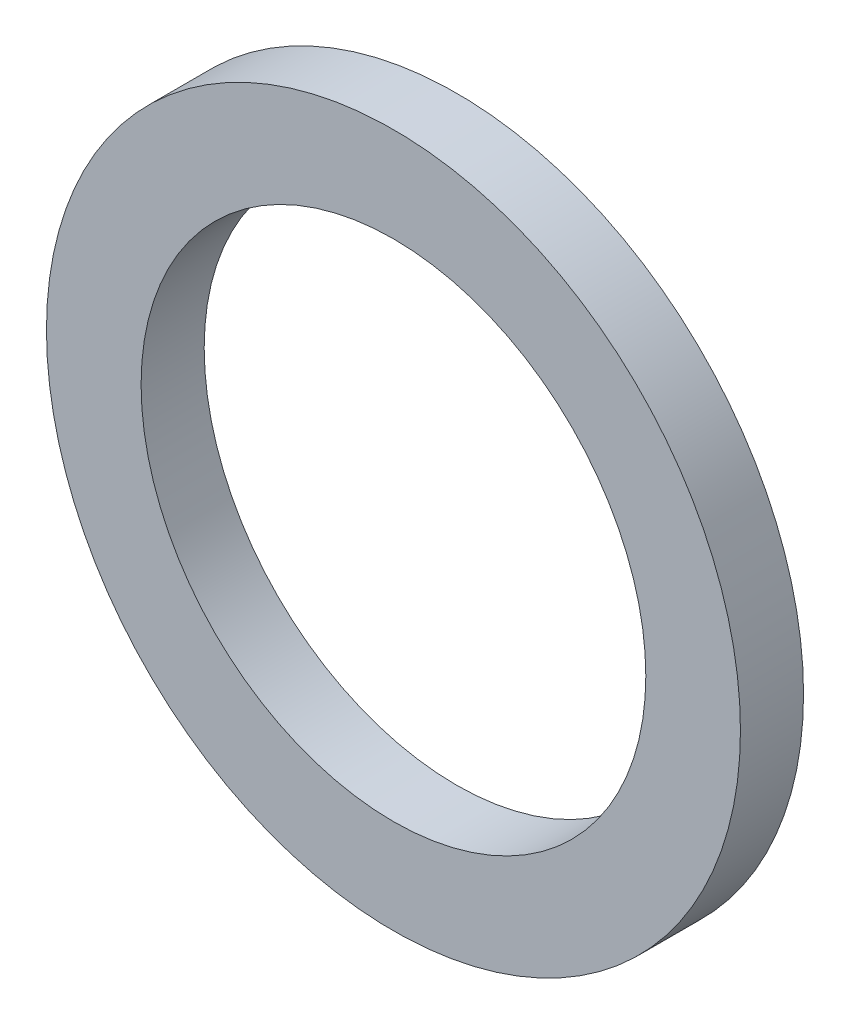
ISO-10303-21;
HEADER;
FILE_DESCRIPTION(('STEP AP214'),'2;1');
FILE_NAME('part.step','',(''),(''),'','','');
FILE_SCHEMA(('AUTOMOTIVE_DESIGN { 1 0 10303 214 1 1 1 1 }'));
ENDSEC;
DATA;
#1=APPLICATION_CONTEXT('core data for automotive mechanical design processes');
#2=APPLICATION_PROTOCOL_DEFINITION('international standard','automotive_design',2000,#1);
#3=PRODUCT_CONTEXT('',#1,'mechanical');
#4=PRODUCT('Part','Part','',(#3));
#5=PRODUCT_RELATED_PRODUCT_CATEGORY('part','',(#4));
#6=PRODUCT_DEFINITION_FORMATION('','',#4);
#7=PRODUCT_DEFINITION_CONTEXT('part definition',#1,'design');
#8=PRODUCT_DEFINITION('design','',#6,#7);
#9=PRODUCT_DEFINITION_SHAPE('','',#8);
#10=(LENGTH_UNIT() NAMED_UNIT(*) SI_UNIT(.MILLI.,.METRE.));
#11=(NAMED_UNIT(*) PLANE_ANGLE_UNIT() SI_UNIT($,.RADIAN.));
#12=(NAMED_UNIT(*) SI_UNIT($,.STERADIAN.) SOLID_ANGLE_UNIT());
#13=UNCERTAINTY_MEASURE_WITH_UNIT(LENGTH_MEASURE(1.E-05),#10,'distance_accuracy_value','');
#14=(GEOMETRIC_REPRESENTATION_CONTEXT(3) GLOBAL_UNCERTAINTY_ASSIGNED_CONTEXT((#13)) GLOBAL_UNIT_ASSIGNED_CONTEXT((#10,
#11,#12)) REPRESENTATION_CONTEXT('',''));
#15=CARTESIAN_POINT('',(0.,0.,0.));
#16=DIRECTION('',(0.,0.,1.));
#17=DIRECTION('',(1.,0.,0.));
#18=AXIS2_PLACEMENT_3D('',#15,#16,#17);
#19=CARTESIAN_POINT('',(0.,0.,2.));
#20=DIRECTION('',(0.,0.,1.));
#21=DIRECTION('',(1.,0.,0.));
#22=AXIS2_PLACEMENT_3D('',#19,#20,#21);
#23=PLANE('',#22);
#24=CARTESIAN_POINT('',(0.,0.,2.));
#25=DIRECTION('',(0.,0.,1.));
#26=DIRECTION('',(1.,0.,0.));
#27=AXIS2_PLACEMENT_3D('',#24,#25,#26);
#28=CIRCLE('',#27,11.);
#29=CARTESIAN_POINT('',(11.,0.,2.));
#30=VERTEX_POINT('',#29);
#31=EDGE_CURVE('E10',#30,#30,#28,.T.);
#32=ORIENTED_EDGE('',*,*,#31,.T.);
#33=EDGE_LOOP('',(#32));
#34=FACE_BOUND('',#33,.T.);
#35=CARTESIAN_POINT('',(0.,0.,2.));
#36=DIRECTION('',(0.,0.,1.));
#37=DIRECTION('',(1.,0.,0.));
#38=AXIS2_PLACEMENT_3D('',#35,#36,#37);
#39=CIRCLE('',#38,8.);
#40=CARTESIAN_POINT('',(8.,0.,2.));
#41=VERTEX_POINT('',#40);
#42=EDGE_CURVE('E52',#41,#41,#39,.T.);
#43=ORIENTED_EDGE('',*,*,#42,.F.);
#44=EDGE_LOOP('',(#43));
#45=FACE_BOUND('',#44,.T.);
#46=ADVANCED_FACE('F41',(#34,#45),#23,.T.);
#47=CARTESIAN_POINT('',(0.,0.,0.));
#48=DIRECTION('',(0.,0.,1.));
#49=DIRECTION('',(1.,0.,0.));
#50=AXIS2_PLACEMENT_3D('',#47,#48,#49);
#51=PLANE('',#50);
#52=CARTESIAN_POINT('',(0.,0.,0.));
#53=DIRECTION('',(0.,0.,1.));
#54=DIRECTION('',(1.,0.,0.));
#55=AXIS2_PLACEMENT_3D('',#52,#53,#54);
#56=CIRCLE('',#55,11.);
#57=CARTESIAN_POINT('',(11.,0.,0.));
#58=VERTEX_POINT('',#57);
#59=EDGE_CURVE('E45',#58,#58,#56,.T.);
#60=ORIENTED_EDGE('',*,*,#59,.F.);
#61=EDGE_LOOP('',(#60));
#62=FACE_BOUND('',#61,.T.);
#63=CARTESIAN_POINT('',(0.,0.,0.));
#64=DIRECTION('',(0.,0.,1.));
#65=DIRECTION('',(1.,0.,0.));
#66=AXIS2_PLACEMENT_3D('',#63,#64,#65);
#67=CIRCLE('',#66,8.);
#68=CARTESIAN_POINT('',(8.,0.,0.));
#69=VERTEX_POINT('',#68);
#70=EDGE_CURVE('E54',#69,#69,#67,.T.);
#71=ORIENTED_EDGE('',*,*,#70,.T.);
#72=EDGE_LOOP('',(#71));
#73=FACE_BOUND('',#72,.T.);
#74=ADVANCED_FACE('F64',(#62,#73),#51,.F.);
#75=CARTESIAN_POINT('',(0.,0.,2.));
#76=DIRECTION('',(0.,0.,-1.));
#77=DIRECTION('',(-1.,0.,0.));
#78=AXIS2_PLACEMENT_3D('',#75,#76,#77);
#79=CYLINDRICAL_SURFACE('',#78,11.);
#80=ORIENTED_EDGE('',*,*,#31,.F.);
#81=EDGE_LOOP('',(#80));
#82=FACE_BOUND('',#81,.T.);
#83=ORIENTED_EDGE('',*,*,#59,.T.);
#84=EDGE_LOOP('',(#83));
#85=FACE_BOUND('',#84,.T.);
#86=ADVANCED_FACE('F43',(#82,#85),#79,.T.);
#87=CARTESIAN_POINT('',(0.,0.,2.));
#88=DIRECTION('',(0.,0.,-1.));
#89=DIRECTION('',(-1.,0.,0.));
#90=AXIS2_PLACEMENT_3D('',#87,#88,#89);
#91=CYLINDRICAL_SURFACE('',#90,8.);
#92=ORIENTED_EDGE('',*,*,#42,.T.);
#93=EDGE_LOOP('',(#92));
#94=FACE_BOUND('',#93,.T.);
#95=ORIENTED_EDGE('',*,*,#70,.F.);
#96=EDGE_LOOP('',(#95));
#97=FACE_BOUND('',#96,.T.);
#98=ADVANCED_FACE('F60',(#94,#97),#91,.F.);
#99=CLOSED_SHELL('',(#46,#74,#86,#98));
#100=MANIFOLD_SOLID_BREP('B2',#99);
#101=ADVANCED_BREP_SHAPE_REPRESENTATION('',(#18,#100),#14);
#102=SHAPE_DEFINITION_REPRESENTATION(#9,#101);
ENDSEC;
END-ISO-10303-21;
